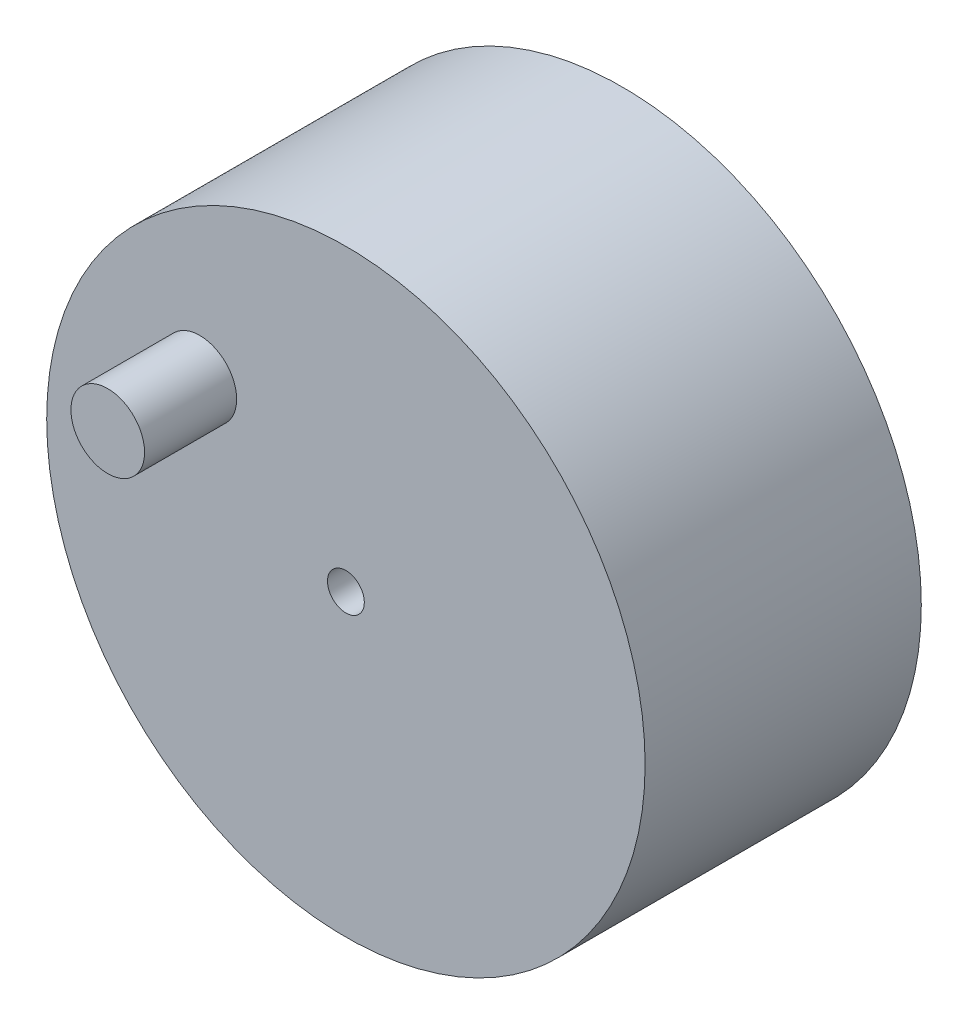
ISO-10303-21;
HEADER;
FILE_DESCRIPTION(('STEP AP214'),'2;1');
FILE_NAME('part.step','',(''),(''),'','','');
FILE_SCHEMA(('AUTOMOTIVE_DESIGN { 1 0 10303 214 1 1 1 1 }'));
ENDSEC;
DATA;
#1=APPLICATION_CONTEXT('core data for automotive mechanical design processes');
#2=APPLICATION_PROTOCOL_DEFINITION('international standard','automotive_design',2000,#1);
#3=PRODUCT_CONTEXT('',#1,'mechanical');
#4=PRODUCT('Part','Part','',(#3));
#5=PRODUCT_RELATED_PRODUCT_CATEGORY('part','',(#4));
#6=PRODUCT_DEFINITION_FORMATION('','',#4);
#7=PRODUCT_DEFINITION_CONTEXT('part definition',#1,'design');
#8=PRODUCT_DEFINITION('design','',#6,#7);
#9=PRODUCT_DEFINITION_SHAPE('','',#8);
#10=(LENGTH_UNIT() NAMED_UNIT(*) SI_UNIT(.MILLI.,.METRE.));
#11=(NAMED_UNIT(*) PLANE_ANGLE_UNIT() SI_UNIT($,.RADIAN.));
#12=(NAMED_UNIT(*) SI_UNIT($,.STERADIAN.) SOLID_ANGLE_UNIT());
#13=UNCERTAINTY_MEASURE_WITH_UNIT(LENGTH_MEASURE(1.E-05),#10,'distance_accuracy_value','');
#14=(GEOMETRIC_REPRESENTATION_CONTEXT(3) GLOBAL_UNCERTAINTY_ASSIGNED_CONTEXT((#13)) GLOBAL_UNIT_ASSIGNED_CONTEXT((#10,
#11,#12)) REPRESENTATION_CONTEXT('',''));
#15=CARTESIAN_POINT('',(0.,0.,0.));
#16=DIRECTION('',(0.,0.,1.));
#17=DIRECTION('',(1.,0.,0.));
#18=AXIS2_PLACEMENT_3D('',#15,#16,#17);
#19=CARTESIAN_POINT('',(0.,0.,30.));
#20=DIRECTION('',(0.,0.,1.));
#21=DIRECTION('',(1.,0.,0.));
#22=AXIS2_PLACEMENT_3D('',#19,#20,#21);
#23=PLANE('',#22);
#24=CARTESIAN_POINT('',(-15.8674906030055,12.1746762570317,30.));
#25=DIRECTION('',(0.,0.,1.));
#26=DIRECTION('',(1.,0.,0.));
#27=AXIS2_PLACEMENT_3D('',#24,#25,#26);
#28=CIRCLE('',#27,4.);
#29=CARTESIAN_POINT('',(-11.8674906030055,12.1746762570317,30.));
#30=VERTEX_POINT('',#29);
#31=EDGE_CURVE('E50',#30,#30,#28,.T.);
#32=ORIENTED_EDGE('',*,*,#31,.F.);
#33=EDGE_LOOP('',(#32));
#34=FACE_BOUND('',#33,.T.);
#35=CARTESIAN_POINT('',(0.,0.,30.));
#36=DIRECTION('',(0.,0.,1.));
#37=DIRECTION('',(1.,0.,0.));
#38=AXIS2_PLACEMENT_3D('',#35,#36,#37);
#39=CIRCLE('',#38,32.5);
#40=CARTESIAN_POINT('',(32.5,0.,30.));
#41=VERTEX_POINT('',#40);
#42=EDGE_CURVE('E10',#41,#41,#39,.T.);
#43=ORIENTED_EDGE('',*,*,#42,.T.);
#44=EDGE_LOOP('',(#43));
#45=FACE_BOUND('',#44,.T.);
#46=CARTESIAN_POINT('',(0.,0.,30.));
#47=DIRECTION('',(0.,0.,1.));
#48=DIRECTION('',(1.,0.,0.));
#49=AXIS2_PLACEMENT_3D('',#46,#47,#48);
#50=CIRCLE('',#49,2.);
#51=CARTESIAN_POINT('',(2.,0.,30.));
#52=VERTEX_POINT('',#51);
#53=EDGE_CURVE('E42',#52,#52,#50,.T.);
#54=ORIENTED_EDGE('',*,*,#53,.F.);
#55=EDGE_LOOP('',(#54));
#56=FACE_BOUND('',#55,.T.);
#57=ADVANCED_FACE('F31',(#34,#45,#56),#23,.T.);
#58=CARTESIAN_POINT('',(0.,0.,0.));
#59=DIRECTION('',(0.,0.,1.));
#60=DIRECTION('',(1.,0.,0.));
#61=AXIS2_PLACEMENT_3D('',#58,#59,#60);
#62=PLANE('',#61);
#63=CARTESIAN_POINT('',(0.,0.,0.));
#64=DIRECTION('',(0.,0.,1.));
#65=DIRECTION('',(1.,0.,0.));
#66=AXIS2_PLACEMENT_3D('',#63,#64,#65);
#67=CIRCLE('',#66,32.5);
#68=CARTESIAN_POINT('',(32.5,0.,0.));
#69=VERTEX_POINT('',#68);
#70=EDGE_CURVE('E35',#69,#69,#67,.T.);
#71=ORIENTED_EDGE('',*,*,#70,.F.);
#72=EDGE_LOOP('',(#71));
#73=FACE_BOUND('',#72,.T.);
#74=CARTESIAN_POINT('',(0.,0.,0.));
#75=DIRECTION('',(0.,0.,1.));
#76=DIRECTION('',(1.,0.,0.));
#77=AXIS2_PLACEMENT_3D('',#74,#75,#76);
#78=CIRCLE('',#77,2.);
#79=CARTESIAN_POINT('',(2.,0.,0.));
#80=VERTEX_POINT('',#79);
#81=EDGE_CURVE('E44',#80,#80,#78,.T.);
#82=ORIENTED_EDGE('',*,*,#81,.T.);
#83=EDGE_LOOP('',(#82));
#84=FACE_BOUND('',#83,.T.);
#85=ADVANCED_FACE('F66',(#73,#84),#62,.F.);
#86=CARTESIAN_POINT('',(0.,0.,30.));
#87=DIRECTION('',(0.,0.,-1.));
#88=DIRECTION('',(-1.,0.,0.));
#89=AXIS2_PLACEMENT_3D('',#86,#87,#88);
#90=CYLINDRICAL_SURFACE('',#89,32.5);
#91=ORIENTED_EDGE('',*,*,#42,.F.);
#92=EDGE_LOOP('',(#91));
#93=FACE_BOUND('',#92,.T.);
#94=ORIENTED_EDGE('',*,*,#70,.T.);
#95=EDGE_LOOP('',(#94));
#96=FACE_BOUND('',#95,.T.);
#97=ADVANCED_FACE('F33',(#93,#96),#90,.T.);
#98=CARTESIAN_POINT('',(0.,0.,30.));
#99=DIRECTION('',(0.,0.,-1.));
#100=DIRECTION('',(-1.,0.,0.));
#101=AXIS2_PLACEMENT_3D('',#98,#99,#100);
#102=CYLINDRICAL_SURFACE('',#101,2.);
#103=ORIENTED_EDGE('',*,*,#53,.T.);
#104=EDGE_LOOP('',(#103));
#105=FACE_BOUND('',#104,.T.);
#106=ORIENTED_EDGE('',*,*,#81,.F.);
#107=EDGE_LOOP('',(#106));
#108=FACE_BOUND('',#107,.T.);
#109=ADVANCED_FACE('F61',(#105,#108),#102,.F.);
#110=CARTESIAN_POINT('',(-15.8674906030055,12.1746762570317,40.));
#111=DIRECTION('',(0.,0.,-1.));
#112=DIRECTION('',(-1.,0.,0.));
#113=AXIS2_PLACEMENT_3D('',#110,#111,#112);
#114=CYLINDRICAL_SURFACE('',#113,4.);
#115=CARTESIAN_POINT('',(-15.8674906030055,12.1746762570317,40.));
#116=DIRECTION('',(0.,0.,1.));
#117=DIRECTION('',(1.,0.,0.));
#118=AXIS2_PLACEMENT_3D('',#115,#116,#117);
#119=CIRCLE('',#118,4.);
#120=CARTESIAN_POINT('',(-11.8674906030055,12.1746762570317,40.));
#121=VERTEX_POINT('',#120);
#122=EDGE_CURVE('E47',#121,#121,#119,.T.);
#123=ORIENTED_EDGE('',*,*,#122,.F.);
#124=EDGE_LOOP('',(#123));
#125=FACE_BOUND('',#124,.T.);
#126=ORIENTED_EDGE('',*,*,#31,.T.);
#127=EDGE_LOOP('',(#126));
#128=FACE_BOUND('',#127,.T.);
#129=ADVANCED_FACE('F58',(#125,#128),#114,.T.);
#130=CARTESIAN_POINT('',(-15.8674906030055,12.1746762570317,40.));
#131=DIRECTION('',(0.,0.,1.));
#132=DIRECTION('',(1.,0.,0.));
#133=AXIS2_PLACEMENT_3D('',#130,#131,#132);
#134=PLANE('',#133);
#135=ORIENTED_EDGE('',*,*,#122,.T.);
#136=EDGE_LOOP('',(#135));
#137=FACE_BOUND('',#136,.T.);
#138=ADVANCED_FACE('F56',(#137),#134,.T.);
#139=CLOSED_SHELL('',(#57,#85,#97,#109,#129,#138));
#140=MANIFOLD_SOLID_BREP('B2',#139);
#141=ADVANCED_BREP_SHAPE_REPRESENTATION('',(#18,#140),#14);
#142=SHAPE_DEFINITION_REPRESENTATION(#9,#141);
ENDSEC;
END-ISO-10303-21;
